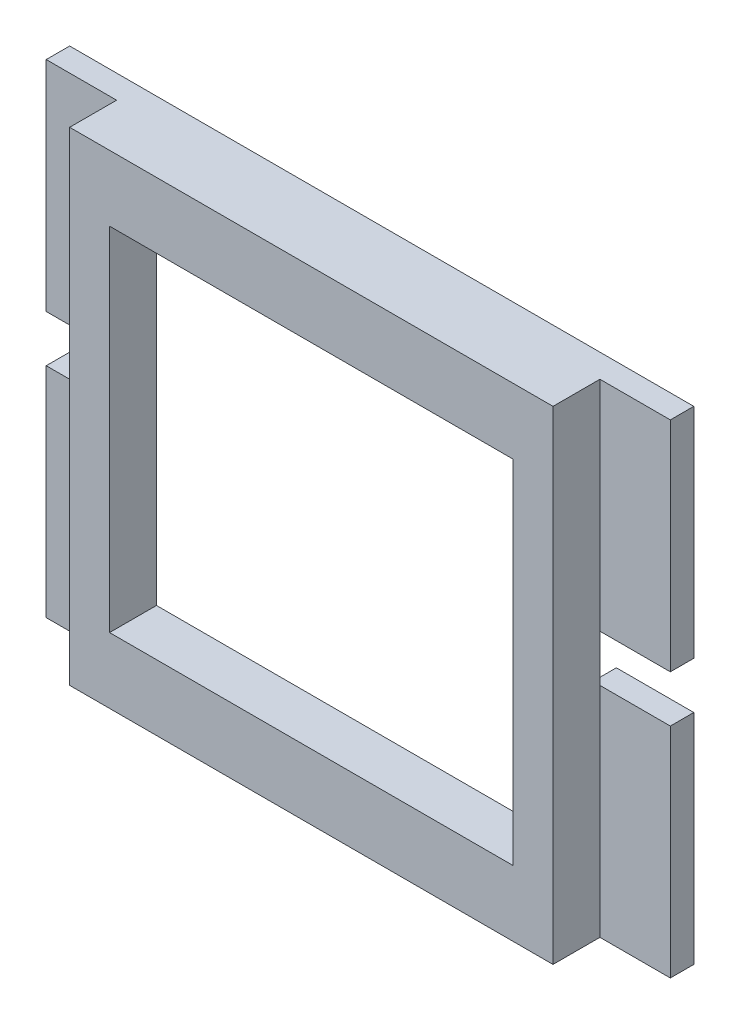
ISO-10303-21;
HEADER;
FILE_DESCRIPTION(('STEP AP214'),'2;1');
FILE_NAME('part.step','',(''),(''),'','','');
FILE_SCHEMA(('AUTOMOTIVE_DESIGN { 1 0 10303 214 1 1 1 1 }'));
ENDSEC;
DATA;
#1=APPLICATION_CONTEXT('core data for automotive mechanical design processes');
#2=APPLICATION_PROTOCOL_DEFINITION('international standard','automotive_design',2000,#1);
#3=PRODUCT_CONTEXT('',#1,'mechanical');
#4=PRODUCT('Part','Part','',(#3));
#5=PRODUCT_RELATED_PRODUCT_CATEGORY('part','',(#4));
#6=PRODUCT_DEFINITION_FORMATION('','',#4);
#7=PRODUCT_DEFINITION_CONTEXT('part definition',#1,'design');
#8=PRODUCT_DEFINITION('design','',#6,#7);
#9=PRODUCT_DEFINITION_SHAPE('','',#8);
#10=(LENGTH_UNIT() NAMED_UNIT(*) SI_UNIT(.MILLI.,.METRE.));
#11=(NAMED_UNIT(*) PLANE_ANGLE_UNIT() SI_UNIT($,.RADIAN.));
#12=(NAMED_UNIT(*) SI_UNIT($,.STERADIAN.) SOLID_ANGLE_UNIT());
#13=UNCERTAINTY_MEASURE_WITH_UNIT(LENGTH_MEASURE(1.E-05),#10,'distance_accuracy_value','');
#14=(GEOMETRIC_REPRESENTATION_CONTEXT(3) GLOBAL_UNCERTAINTY_ASSIGNED_CONTEXT((#13)) GLOBAL_UNIT_ASSIGNED_CONTEXT((#10,
#11,#12)) REPRESENTATION_CONTEXT('',''));
#15=CARTESIAN_POINT('',(0.,0.,0.));
#16=DIRECTION('',(0.,0.,1.));
#17=DIRECTION('',(1.,0.,0.));
#18=AXIS2_PLACEMENT_3D('',#15,#16,#17);
#19=CARTESIAN_POINT('',(0.,0.,0.));
#20=DIRECTION('',(0.,0.,1.));
#21=DIRECTION('',(1.,0.,0.));
#22=AXIS2_PLACEMENT_3D('',#19,#20,#21);
#23=PLANE('',#22);
#24=DIRECTION('',(-1.,0.,0.));
#25=VECTOR('',#24,1.);
#26=CARTESIAN_POINT('',(0.,-56.5,0.));
#27=LINE('',#26,#25);
#28=CARTESIAN_POINT('',(118.,-56.5,0.));
#29=VERTEX_POINT('',#28);
#30=CARTESIAN_POINT('',(101.5,-56.5,0.));
#31=VERTEX_POINT('',#30);
#32=EDGE_CURVE('E305',#29,#31,#27,.T.);
#33=ORIENTED_EDGE('',*,*,#32,.F.);
#34=DIRECTION('',(0.,-1.,0.));
#35=VECTOR('',#34,1.);
#36=CARTESIAN_POINT('',(118.,0.,0.));
#37=LINE('',#36,#35);
#38=CARTESIAN_POINT('',(118.,-103.,0.));
#39=VERTEX_POINT('',#38);
#40=EDGE_CURVE('E223',#29,#39,#37,.T.);
#41=ORIENTED_EDGE('',*,*,#40,.T.);
#42=DIRECTION('',(1.,0.,0.));
#43=VECTOR('',#42,1.);
#44=CARTESIAN_POINT('',(0.,-103.,0.));
#45=LINE('',#44,#43);
#46=CARTESIAN_POINT('',(-15.,-103.,0.));
#47=VERTEX_POINT('',#46);
#48=EDGE_CURVE('E270',#47,#39,#45,.T.);
#49=ORIENTED_EDGE('',*,*,#48,.F.);
#50=DIRECTION('',(0.,1.,0.));
#51=VECTOR('',#50,1.);
#52=CARTESIAN_POINT('',(-15.,0.,0.));
#53=LINE('',#52,#51);
#54=CARTESIAN_POINT('',(-15.,-56.5,0.));
#55=VERTEX_POINT('',#54);
#56=EDGE_CURVE('E264',#47,#55,#53,.T.);
#57=ORIENTED_EDGE('',*,*,#56,.T.);
#58=DIRECTION('',(1.,0.,0.));
#59=VECTOR('',#58,1.);
#60=CARTESIAN_POINT('',(0.,-56.5,0.));
#61=LINE('',#60,#59);
#62=CARTESIAN_POINT('',(1.5,-56.5,0.));
#63=VERTEX_POINT('',#62);
#64=EDGE_CURVE('E367',#55,#63,#61,.T.);
#65=ORIENTED_EDGE('',*,*,#64,.T.);
#66=DIRECTION('',(0.,1.,0.));
#67=VECTOR('',#66,1.);
#68=CARTESIAN_POINT('',(1.5,0.,0.));
#69=LINE('',#68,#67);
#70=CARTESIAN_POINT('',(1.5,-101.5,0.));
#71=VERTEX_POINT('',#70);
#72=EDGE_CURVE('E423',#71,#63,#69,.T.);
#73=ORIENTED_EDGE('',*,*,#72,.F.);
#74=DIRECTION('',(-1.,0.,0.));
#75=VECTOR('',#74,1.);
#76=CARTESIAN_POINT('',(0.,-101.5,0.));
#77=LINE('',#76,#75);
#78=CARTESIAN_POINT('',(101.5,-101.5,0.));
#79=VERTEX_POINT('',#78);
#80=EDGE_CURVE('E400',#79,#71,#77,.T.);
#81=ORIENTED_EDGE('',*,*,#80,.F.);
#82=DIRECTION('',(0.,1.,0.));
#83=VECTOR('',#82,1.);
#84=CARTESIAN_POINT('',(101.5,0.,0.));
#85=LINE('',#84,#83);
#86=EDGE_CURVE('E316',#79,#31,#85,.T.);
#87=ORIENTED_EDGE('',*,*,#86,.T.);
#88=EDGE_LOOP('',(#33,#41,#49,#57,#65,#73,#81,#87));
#89=FACE_BOUND('',#88,.T.);
#90=ADVANCED_FACE('F33',(#89),#23,.F.);
#91=DIRECTION('',(1.,0.,0.));
#92=VECTOR('',#91,1.);
#93=CARTESIAN_POINT('',(0.,-46.5,0.));
#94=LINE('',#93,#92);
#95=CARTESIAN_POINT('',(101.5,-46.5,0.));
#96=VERTEX_POINT('',#95);
#97=CARTESIAN_POINT('',(118.,-46.5,0.));
#98=VERTEX_POINT('',#97);
#99=EDGE_CURVE('E439',#96,#98,#94,.T.);
#100=ORIENTED_EDGE('',*,*,#99,.F.);
#101=CARTESIAN_POINT('',(101.5,-1.49999999999999,0.));
#102=VERTEX_POINT('',#101);
#103=EDGE_CURVE('E427',#96,#102,#85,.T.);
#104=ORIENTED_EDGE('',*,*,#103,.T.);
#105=DIRECTION('',(-1.,0.,0.));
#106=VECTOR('',#105,1.);
#107=CARTESIAN_POINT('',(0.,-1.5,0.));
#108=LINE('',#107,#106);
#109=CARTESIAN_POINT('',(1.5,-1.5,0.));
#110=VERTEX_POINT('',#109);
#111=EDGE_CURVE('E425',#102,#110,#108,.T.);
#112=ORIENTED_EDGE('',*,*,#111,.T.);
#113=CARTESIAN_POINT('',(1.5,-46.5,0.));
#114=VERTEX_POINT('',#113);
#115=EDGE_CURVE('E422',#114,#110,#69,.T.);
#116=ORIENTED_EDGE('',*,*,#115,.F.);
#117=DIRECTION('',(-1.,0.,0.));
#118=VECTOR('',#117,1.);
#119=CARTESIAN_POINT('',(0.,-46.5,0.));
#120=LINE('',#119,#118);
#121=CARTESIAN_POINT('',(-15.,-46.5,0.));
#122=VERTEX_POINT('',#121);
#123=EDGE_CURVE('E372',#114,#122,#120,.T.);
#124=ORIENTED_EDGE('',*,*,#123,.T.);
#125=CARTESIAN_POINT('',(-15.,0.,0.));
#126=VERTEX_POINT('',#125);
#127=EDGE_CURVE('E246',#122,#126,#53,.T.);
#128=ORIENTED_EDGE('',*,*,#127,.T.);
#129=DIRECTION('',(-1.,0.,0.));
#130=VECTOR('',#129,1.);
#131=CARTESIAN_POINT('',(0.,0.,0.));
#132=LINE('',#131,#130);
#133=CARTESIAN_POINT('',(118.,0.,0.));
#134=VERTEX_POINT('',#133);
#135=EDGE_CURVE('E277',#134,#126,#132,.T.);
#136=ORIENTED_EDGE('',*,*,#135,.F.);
#137=EDGE_CURVE('E240',#134,#98,#37,.T.);
#138=ORIENTED_EDGE('',*,*,#137,.T.);
#139=EDGE_LOOP('',(#100,#104,#112,#116,#124,#128,#136,#138));
#140=FACE_BOUND('',#139,.T.);
#141=ADVANCED_FACE('F465',(#140),#23,.F.);
#142=CARTESIAN_POINT('',(118.,0.,5.));
#143=DIRECTION('',(1.,0.,0.));
#144=DIRECTION('',(0.,1.,0.));
#145=AXIS2_PLACEMENT_3D('',#142,#143,#144);
#146=PLANE('',#145);
#147=ORIENTED_EDGE('',*,*,#40,.F.);
#148=DIRECTION('',(0.,0.,1.));
#149=VECTOR('',#148,1.);
#150=CARTESIAN_POINT('',(118.,-56.5,5.));
#151=LINE('',#150,#149);
#152=CARTESIAN_POINT('',(118.,-56.5,5.));
#153=VERTEX_POINT('',#152);
#154=EDGE_CURVE('E209',#29,#153,#151,.T.);
#155=ORIENTED_EDGE('',*,*,#154,.T.);
#156=DIRECTION('',(0.,-1.,0.));
#157=VECTOR('',#156,1.);
#158=CARTESIAN_POINT('',(118.,0.,5.));
#159=LINE('',#158,#157);
#160=CARTESIAN_POINT('',(118.,-103.,5.));
#161=VERTEX_POINT('',#160);
#162=EDGE_CURVE('E221',#153,#161,#159,.T.);
#163=ORIENTED_EDGE('',*,*,#162,.T.);
#164=DIRECTION('',(0.,0.,-1.));
#165=VECTOR('',#164,1.);
#166=CARTESIAN_POINT('',(118.,-103.,5.));
#167=LINE('',#166,#165);
#168=EDGE_CURVE('E244',#161,#39,#167,.T.);
#169=ORIENTED_EDGE('',*,*,#168,.T.);
#170=EDGE_LOOP('',(#147,#155,#163,#169));
#171=FACE_BOUND('',#170,.T.);
#172=ADVANCED_FACE('F219',(#171),#146,.T.);
#173=CARTESIAN_POINT('',(118.,0.,5.));
#174=VERTEX_POINT('',#173);
#175=CARTESIAN_POINT('',(118.,-46.5,5.));
#176=VERTEX_POINT('',#175);
#177=EDGE_CURVE('E229',#174,#176,#159,.T.);
#178=ORIENTED_EDGE('',*,*,#177,.T.);
#179=DIRECTION('',(0.,0.,-1.));
#180=VECTOR('',#179,1.);
#181=CARTESIAN_POINT('',(118.,-46.5,5.));
#182=LINE('',#181,#180);
#183=EDGE_CURVE('E445',#176,#98,#182,.T.);
#184=ORIENTED_EDGE('',*,*,#183,.T.);
#185=ORIENTED_EDGE('',*,*,#137,.F.);
#186=DIRECTION('',(0.,0.,-1.));
#187=VECTOR('',#186,1.);
#188=CARTESIAN_POINT('',(118.,0.,5.));
#189=LINE('',#188,#187);
#190=EDGE_CURVE('E239',#174,#134,#189,.T.);
#191=ORIENTED_EDGE('',*,*,#190,.F.);
#192=EDGE_LOOP('',(#178,#184,#185,#191));
#193=FACE_BOUND('',#192,.T.);
#194=ADVANCED_FACE('F536',(#193),#146,.T.);
#195=CARTESIAN_POINT('',(0.,0.,5.));
#196=DIRECTION('',(0.,0.,1.));
#197=DIRECTION('',(1.,0.,0.));
#198=AXIS2_PLACEMENT_3D('',#195,#196,#197);
#199=PLANE('',#198);
#200=ORIENTED_EDGE('',*,*,#162,.F.);
#201=DIRECTION('',(1.,0.,0.));
#202=VECTOR('',#201,1.);
#203=CARTESIAN_POINT('',(-5.64213562373093,-56.5,5.));
#204=LINE('',#203,#202);
#205=CARTESIAN_POINT('',(103.,-56.5,5.));
#206=VERTEX_POINT('',#205);
#207=EDGE_CURVE('E206',#206,#153,#204,.T.);
#208=ORIENTED_EDGE('',*,*,#207,.F.);
#209=DIRECTION('',(0.,1.,0.));
#210=VECTOR('',#209,1.);
#211=CARTESIAN_POINT('',(103.,0.,5.));
#212=LINE('',#211,#210);
#213=CARTESIAN_POINT('',(103.,-103.,5.));
#214=VERTEX_POINT('',#213);
#215=EDGE_CURVE('E234',#214,#206,#212,.T.);
#216=ORIENTED_EDGE('',*,*,#215,.F.);
#217=DIRECTION('',(-1.,0.,0.));
#218=VECTOR('',#217,1.);
#219=CARTESIAN_POINT('',(103.,-103.,5.));
#220=LINE('',#219,#218);
#221=EDGE_CURVE('E228',#161,#214,#220,.T.);
#222=ORIENTED_EDGE('',*,*,#221,.F.);
#223=EDGE_LOOP('',(#200,#208,#216,#222));
#224=FACE_BOUND('',#223,.T.);
#225=ADVANCED_FACE('F226',(#224),#199,.T.);
#226=CARTESIAN_POINT('',(103.,-46.5,5.));
#227=VERTEX_POINT('',#226);
#228=CARTESIAN_POINT('',(103.,0.,5.));
#229=VERTEX_POINT('',#228);
#230=EDGE_CURVE('E243',#227,#229,#212,.T.);
#231=ORIENTED_EDGE('',*,*,#230,.F.);
#232=DIRECTION('',(1.,0.,0.));
#233=VECTOR('',#232,1.);
#234=CARTESIAN_POINT('',(-5.64213562373095,-46.5,5.));
#235=LINE('',#234,#233);
#236=EDGE_CURVE('E446',#227,#176,#235,.T.);
#237=ORIENTED_EDGE('',*,*,#236,.T.);
#238=ORIENTED_EDGE('',*,*,#177,.F.);
#239=DIRECTION('',(1.,0.,0.));
#240=VECTOR('',#239,1.);
#241=CARTESIAN_POINT('',(103.,0.,5.));
#242=LINE('',#241,#240);
#243=EDGE_CURVE('E230',#229,#174,#242,.T.);
#244=ORIENTED_EDGE('',*,*,#243,.F.);
#245=EDGE_LOOP('',(#231,#237,#238,#244));
#246=FACE_BOUND('',#245,.T.);
#247=ADVANCED_FACE('F331',(#246),#199,.T.);
#248=CARTESIAN_POINT('',(101.5,0.,5.));
#249=DIRECTION('',(-1.,0.,0.));
#250=DIRECTION('',(0.,0.,1.));
#251=AXIS2_PLACEMENT_3D('',#248,#249,#250);
#252=PLANE('',#251);
#253=DIRECTION('',(0.,1.,0.));
#254=VECTOR('',#253,1.);
#255=CARTESIAN_POINT('',(101.5,0.,5.));
#256=LINE('',#255,#254);
#257=CARTESIAN_POINT('',(101.5,-101.5,5.));
#258=VERTEX_POINT('',#257);
#259=CARTESIAN_POINT('',(101.5,-56.5,5.));
#260=VERTEX_POINT('',#259);
#261=EDGE_CURVE('E323',#258,#260,#256,.T.);
#262=ORIENTED_EDGE('',*,*,#261,.T.);
#263=DIRECTION('',(0.,0.,-1.));
#264=VECTOR('',#263,1.);
#265=CARTESIAN_POINT('',(101.5,-56.5,5.));
#266=LINE('',#265,#264);
#267=EDGE_CURVE('E355',#260,#31,#266,.T.);
#268=ORIENTED_EDGE('',*,*,#267,.T.);
#269=ORIENTED_EDGE('',*,*,#86,.F.);
#270=DIRECTION('',(0.,0.,-1.));
#271=VECTOR('',#270,1.);
#272=CARTESIAN_POINT('',(101.5,-101.5,5.));
#273=LINE('',#272,#271);
#274=EDGE_CURVE('E306',#258,#79,#273,.T.);
#275=ORIENTED_EDGE('',*,*,#274,.F.);
#276=EDGE_LOOP('',(#262,#268,#269,#275));
#277=FACE_BOUND('',#276,.T.);
#278=ADVANCED_FACE('F437',(#277),#252,.T.);
#279=ORIENTED_EDGE('',*,*,#103,.F.);
#280=DIRECTION('',(0.,0.,1.));
#281=VECTOR('',#280,1.);
#282=CARTESIAN_POINT('',(101.5,-46.5,5.));
#283=LINE('',#282,#281);
#284=CARTESIAN_POINT('',(101.5,-46.5,5.));
#285=VERTEX_POINT('',#284);
#286=EDGE_CURVE('E440',#96,#285,#283,.T.);
#287=ORIENTED_EDGE('',*,*,#286,.T.);
#288=CARTESIAN_POINT('',(101.5,-1.49999999999999,5.));
#289=VERTEX_POINT('',#288);
#290=EDGE_CURVE('E418',#285,#289,#256,.T.);
#291=ORIENTED_EDGE('',*,*,#290,.T.);
#292=DIRECTION('',(0.,0.,-1.));
#293=VECTOR('',#292,1.);
#294=CARTESIAN_POINT('',(101.5,-1.49999999999999,5.));
#295=LINE('',#294,#293);
#296=EDGE_CURVE('E307',#289,#102,#295,.T.);
#297=ORIENTED_EDGE('',*,*,#296,.T.);
#298=EDGE_LOOP('',(#279,#287,#291,#297));
#299=FACE_BOUND('',#298,.T.);
#300=ADVANCED_FACE('F458',(#299),#252,.T.);
#301=CARTESIAN_POINT('',(-15.,0.,5.));
#302=DIRECTION('',(-1.,0.,0.));
#303=DIRECTION('',(0.,-1.,0.));
#304=AXIS2_PLACEMENT_3D('',#301,#302,#303);
#305=PLANE('',#304);
#306=DIRECTION('',(0.,0.,-1.));
#307=VECTOR('',#306,1.);
#308=CARTESIAN_POINT('',(-15.,-46.5,5.));
#309=LINE('',#308,#307);
#310=CARTESIAN_POINT('',(-15.,-46.5,5.));
#311=VERTEX_POINT('',#310);
#312=EDGE_CURVE('E352',#311,#122,#309,.T.);
#313=ORIENTED_EDGE('',*,*,#312,.F.);
#314=DIRECTION('',(0.,1.,0.));
#315=VECTOR('',#314,1.);
#316=CARTESIAN_POINT('',(-15.,0.,5.));
#317=LINE('',#316,#315);
#318=CARTESIAN_POINT('',(-15.,0.,5.));
#319=VERTEX_POINT('',#318);
#320=EDGE_CURVE('E256',#311,#319,#317,.T.);
#321=ORIENTED_EDGE('',*,*,#320,.T.);
#322=DIRECTION('',(0.,0.,-1.));
#323=VECTOR('',#322,1.);
#324=CARTESIAN_POINT('',(-15.,0.,5.));
#325=LINE('',#324,#323);
#326=EDGE_CURVE('E267',#319,#126,#325,.T.);
#327=ORIENTED_EDGE('',*,*,#326,.T.);
#328=ORIENTED_EDGE('',*,*,#127,.F.);
#329=EDGE_LOOP('',(#313,#321,#327,#328));
#330=FACE_BOUND('',#329,.T.);
#331=ADVANCED_FACE('F470',(#330),#305,.T.);
#332=CARTESIAN_POINT('',(0.,0.,5.));
#333=DIRECTION('',(0.,0.,-1.));
#334=DIRECTION('',(-1.,0.,0.));
#335=AXIS2_PLACEMENT_3D('',#332,#333,#334);
#336=PLANE('',#335);
#337=ORIENTED_EDGE('',*,*,#320,.F.);
#338=DIRECTION('',(-1.,0.,0.));
#339=VECTOR('',#338,1.);
#340=CARTESIAN_POINT('',(22.642135623731,-46.5,5.));
#341=LINE('',#340,#339);
#342=CARTESIAN_POINT('',(0.,-46.5,5.));
#343=VERTEX_POINT('',#342);
#344=EDGE_CURVE('E359',#343,#311,#341,.T.);
#345=ORIENTED_EDGE('',*,*,#344,.F.);
#346=DIRECTION('',(0.,-1.,0.));
#347=VECTOR('',#346,1.);
#348=CARTESIAN_POINT('',(0.,0.,5.));
#349=LINE('',#348,#347);
#350=CARTESIAN_POINT('',(0.,0.,5.));
#351=VERTEX_POINT('',#350);
#352=EDGE_CURVE('E249',#351,#343,#349,.T.);
#353=ORIENTED_EDGE('',*,*,#352,.F.);
#354=DIRECTION('',(1.,0.,0.));
#355=VECTOR('',#354,1.);
#356=CARTESIAN_POINT('',(0.,0.,5.));
#357=LINE('',#356,#355);
#358=EDGE_CURVE('E260',#319,#351,#357,.T.);
#359=ORIENTED_EDGE('',*,*,#358,.F.);
#360=EDGE_LOOP('',(#337,#345,#353,#359));
#361=FACE_BOUND('',#360,.T.);
#362=ADVANCED_FACE('F475',(#361),#336,.F.);
#363=CARTESIAN_POINT('',(1.5,0.,5.));
#364=DIRECTION('',(-1.,0.,0.));
#365=DIRECTION('',(0.,0.,1.));
#366=AXIS2_PLACEMENT_3D('',#363,#364,#365);
#367=PLANE('',#366);
#368=DIRECTION('',(0.,1.,0.));
#369=VECTOR('',#368,1.);
#370=CARTESIAN_POINT('',(1.5,0.,5.));
#371=LINE('',#370,#369);
#372=CARTESIAN_POINT('',(1.49999999999999,-46.5,5.));
#373=VERTEX_POINT('',#372);
#374=CARTESIAN_POINT('',(1.5,-1.5,5.));
#375=VERTEX_POINT('',#374);
#376=EDGE_CURVE('E411',#373,#375,#371,.T.);
#377=ORIENTED_EDGE('',*,*,#376,.F.);
#378=DIRECTION('',(0.,0.,-1.));
#379=VECTOR('',#378,1.);
#380=CARTESIAN_POINT('',(1.5,-46.5,5.));
#381=LINE('',#380,#379);
#382=EDGE_CURVE('E369',#373,#114,#381,.T.);
#383=ORIENTED_EDGE('',*,*,#382,.T.);
#384=ORIENTED_EDGE('',*,*,#115,.T.);
#385=DIRECTION('',(0.,0.,-1.));
#386=VECTOR('',#385,1.);
#387=CARTESIAN_POINT('',(1.5,-1.5,5.));
#388=LINE('',#387,#386);
#389=EDGE_CURVE('E313',#375,#110,#388,.T.);
#390=ORIENTED_EDGE('',*,*,#389,.F.);
#391=EDGE_LOOP('',(#377,#383,#384,#390));
#392=FACE_BOUND('',#391,.T.);
#393=ADVANCED_FACE('F464',(#392),#367,.F.);
#394=CARTESIAN_POINT('',(0.,0.,15.));
#395=DIRECTION('',(1.,0.,0.));
#396=DIRECTION('',(0.,0.,-1.));
#397=AXIS2_PLACEMENT_3D('',#394,#395,#396);
#398=PLANE('',#397);
#399=DIRECTION('',(0.,0.,-1.));
#400=VECTOR('',#399,1.);
#401=CARTESIAN_POINT('',(0.,0.,15.));
#402=LINE('',#401,#400);
#403=CARTESIAN_POINT('',(0.,0.,15.));
#404=VERTEX_POINT('',#403);
#405=EDGE_CURVE('E283',#404,#351,#402,.T.);
#406=ORIENTED_EDGE('',*,*,#405,.T.);
#407=ORIENTED_EDGE('',*,*,#352,.T.);
#408=DIRECTION('',(0.,-1.,0.));
#409=VECTOR('',#408,1.);
#410=CARTESIAN_POINT('',(0.,0.,5.));
#411=LINE('',#410,#409);
#412=CARTESIAN_POINT('',(0.,-56.5,5.));
#413=VERTEX_POINT('',#412);
#414=EDGE_CURVE('E363',#343,#413,#411,.T.);
#415=ORIENTED_EDGE('',*,*,#414,.T.);
#416=CARTESIAN_POINT('',(0.,-103.,5.));
#417=VERTEX_POINT('',#416);
#418=EDGE_CURVE('E253',#413,#417,#349,.T.);
#419=ORIENTED_EDGE('',*,*,#418,.T.);
#420=DIRECTION('',(0.,0.,-1.));
#421=VECTOR('',#420,1.);
#422=CARTESIAN_POINT('',(0.,-103.,15.));
#423=LINE('',#422,#421);
#424=CARTESIAN_POINT('',(0.,-103.,15.));
#425=VERTEX_POINT('',#424);
#426=EDGE_CURVE('E11',#425,#417,#423,.T.);
#427=ORIENTED_EDGE('',*,*,#426,.F.);
#428=DIRECTION('',(0.,-1.,0.));
#429=VECTOR('',#428,1.);
#430=CARTESIAN_POINT('',(0.,0.,15.));
#431=LINE('',#430,#429);
#432=EDGE_CURVE('E273',#404,#425,#431,.T.);
#433=ORIENTED_EDGE('',*,*,#432,.F.);
#434=EDGE_LOOP('',(#406,#407,#415,#419,#427,#433));
#435=FACE_BOUND('',#434,.T.);
#436=ADVANCED_FACE('F35',(#435),#398,.F.);
#437=CARTESIAN_POINT('',(0.,-103.,15.));
#438=DIRECTION('',(0.,1.,0.));
#439=DIRECTION('',(0.,0.,1.));
#440=AXIS2_PLACEMENT_3D('',#437,#438,#439);
#441=PLANE('',#440);
#442=ORIENTED_EDGE('',*,*,#48,.T.);
#443=ORIENTED_EDGE('',*,*,#168,.F.);
#444=ORIENTED_EDGE('',*,*,#221,.T.);
#445=DIRECTION('',(0.,0.,-1.));
#446=VECTOR('',#445,1.);
#447=CARTESIAN_POINT('',(103.,-103.,15.));
#448=LINE('',#447,#446);
#449=CARTESIAN_POINT('',(103.,-103.,15.));
#450=VERTEX_POINT('',#449);
#451=EDGE_CURVE('E41',#450,#214,#448,.T.);
#452=ORIENTED_EDGE('',*,*,#451,.F.);
#453=DIRECTION('',(1.,0.,0.));
#454=VECTOR('',#453,1.);
#455=CARTESIAN_POINT('',(0.,-103.,15.));
#456=LINE('',#455,#454);
#457=EDGE_CURVE('E276',#425,#450,#456,.T.);
#458=ORIENTED_EDGE('',*,*,#457,.F.);
#459=ORIENTED_EDGE('',*,*,#426,.T.);
#460=DIRECTION('',(-1.,0.,0.));
#461=VECTOR('',#460,1.);
#462=CARTESIAN_POINT('',(0.,-103.,5.));
#463=LINE('',#462,#461);
#464=CARTESIAN_POINT('',(-15.,-103.,5.));
#465=VERTEX_POINT('',#464);
#466=EDGE_CURVE('E252',#417,#465,#463,.T.);
#467=ORIENTED_EDGE('',*,*,#466,.T.);
#468=DIRECTION('',(0.,0.,-1.));
#469=VECTOR('',#468,1.);
#470=CARTESIAN_POINT('',(-15.,-103.,5.));
#471=LINE('',#470,#469);
#472=EDGE_CURVE('E263',#465,#47,#471,.T.);
#473=ORIENTED_EDGE('',*,*,#472,.T.);
#474=EDGE_LOOP('',(#442,#443,#444,#452,#458,#459,#467,#473));
#475=FACE_BOUND('',#474,.T.);
#476=ADVANCED_FACE('F300',(#475),#441,.F.);
#477=CARTESIAN_POINT('',(103.,0.,15.));
#478=DIRECTION('',(-1.,0.,0.));
#479=DIRECTION('',(0.,-1.,0.));
#480=AXIS2_PLACEMENT_3D('',#477,#478,#479);
#481=PLANE('',#480);
#482=ORIENTED_EDGE('',*,*,#451,.T.);
#483=ORIENTED_EDGE('',*,*,#215,.T.);
#484=DIRECTION('',(0.,-1.,0.));
#485=VECTOR('',#484,1.);
#486=CARTESIAN_POINT('',(103.,0.,5.));
#487=LINE('',#486,#485);
#488=EDGE_CURVE('E327',#227,#206,#487,.T.);
#489=ORIENTED_EDGE('',*,*,#488,.F.);
#490=ORIENTED_EDGE('',*,*,#230,.T.);
#491=DIRECTION('',(0.,0.,-1.));
#492=VECTOR('',#491,1.);
#493=CARTESIAN_POINT('',(103.,0.,15.));
#494=LINE('',#493,#492);
#495=CARTESIAN_POINT('',(103.,0.,15.));
#496=VERTEX_POINT('',#495);
#497=EDGE_CURVE('E290',#496,#229,#494,.T.);
#498=ORIENTED_EDGE('',*,*,#497,.F.);
#499=DIRECTION('',(0.,1.,0.));
#500=VECTOR('',#499,1.);
#501=CARTESIAN_POINT('',(103.,0.,15.));
#502=LINE('',#501,#500);
#503=EDGE_CURVE('E279',#450,#496,#502,.T.);
#504=ORIENTED_EDGE('',*,*,#503,.F.);
#505=EDGE_LOOP('',(#482,#483,#489,#490,#498,#504));
#506=FACE_BOUND('',#505,.T.);
#507=ADVANCED_FACE('F296',(#506),#481,.F.);
#508=CARTESIAN_POINT('',(0.,0.,15.));
#509=DIRECTION('',(0.,-1.,0.));
#510=DIRECTION('',(0.,0.,-1.));
#511=AXIS2_PLACEMENT_3D('',#508,#509,#510);
#512=PLANE('',#511);
#513=ORIENTED_EDGE('',*,*,#135,.T.);
#514=ORIENTED_EDGE('',*,*,#326,.F.);
#515=ORIENTED_EDGE('',*,*,#358,.T.);
#516=ORIENTED_EDGE('',*,*,#405,.F.);
#517=DIRECTION('',(-1.,0.,0.));
#518=VECTOR('',#517,1.);
#519=CARTESIAN_POINT('',(0.,0.,15.));
#520=LINE('',#519,#518);
#521=EDGE_CURVE('E281',#496,#404,#520,.T.);
#522=ORIENTED_EDGE('',*,*,#521,.F.);
#523=ORIENTED_EDGE('',*,*,#497,.T.);
#524=ORIENTED_EDGE('',*,*,#243,.T.);
#525=ORIENTED_EDGE('',*,*,#190,.T.);
#526=EDGE_LOOP('',(#513,#514,#515,#516,#522,#523,#524,#525));
#527=FACE_BOUND('',#526,.T.);
#528=ADVANCED_FACE('F333',(#527),#512,.F.);
#529=CARTESIAN_POINT('',(0.,0.,15.));
#530=DIRECTION('',(0.,0.,1.));
#531=DIRECTION('',(1.,0.,0.));
#532=AXIS2_PLACEMENT_3D('',#529,#530,#531);
#533=PLANE('',#532);
#534=DIRECTION('',(0.,1.,0.));
#535=VECTOR('',#534,1.);
#536=CARTESIAN_POINT('',(8.50000000000001,-89.,15.));
#537=LINE('',#536,#535);
#538=CARTESIAN_POINT('',(8.50000000000001,-89.,15.));
#539=VERTEX_POINT('',#538);
#540=CARTESIAN_POINT('',(8.50000000000001,-14.,15.));
#541=VERTEX_POINT('',#540);
#542=EDGE_CURVE('E376',#539,#541,#537,.T.);
#543=ORIENTED_EDGE('',*,*,#542,.T.);
#544=DIRECTION('',(1.,0.,0.));
#545=VECTOR('',#544,1.);
#546=CARTESIAN_POINT('',(94.5,-14.,15.));
#547=LINE('',#546,#545);
#548=CARTESIAN_POINT('',(94.5,-14.,15.));
#549=VERTEX_POINT('',#548);
#550=EDGE_CURVE('E379',#541,#549,#547,.T.);
#551=ORIENTED_EDGE('',*,*,#550,.T.);
#552=DIRECTION('',(0.,-1.,0.));
#553=VECTOR('',#552,1.);
#554=CARTESIAN_POINT('',(94.5,-89.,15.));
#555=LINE('',#554,#553);
#556=CARTESIAN_POINT('',(94.5,-89.,15.));
#557=VERTEX_POINT('',#556);
#558=EDGE_CURVE('E383',#549,#557,#555,.T.);
#559=ORIENTED_EDGE('',*,*,#558,.T.);
#560=DIRECTION('',(-1.,0.,0.));
#561=VECTOR('',#560,1.);
#562=CARTESIAN_POINT('',(94.5,-89.,15.));
#563=LINE('',#562,#561);
#564=EDGE_CURVE('E386',#557,#539,#563,.T.);
#565=ORIENTED_EDGE('',*,*,#564,.T.);
#566=EDGE_LOOP('',(#543,#551,#559,#565));
#567=FACE_BOUND('',#566,.T.);
#568=ORIENTED_EDGE('',*,*,#432,.T.);
#569=ORIENTED_EDGE('',*,*,#457,.T.);
#570=ORIENTED_EDGE('',*,*,#503,.T.);
#571=ORIENTED_EDGE('',*,*,#521,.T.);
#572=EDGE_LOOP('',(#568,#569,#570,#571));
#573=FACE_BOUND('',#572,.T.);
#574=ADVANCED_FACE('F337',(#567,#573),#533,.T.);
#575=DIRECTION('',(0.,0.,1.));
#576=VECTOR('',#575,1.);
#577=CARTESIAN_POINT('',(-15.,-56.5,5.));
#578=LINE('',#577,#576);
#579=CARTESIAN_POINT('',(-15.,-56.5,5.));
#580=VERTEX_POINT('',#579);
#581=EDGE_CURVE('E351',#55,#580,#578,.T.);
#582=ORIENTED_EDGE('',*,*,#581,.F.);
#583=ORIENTED_EDGE('',*,*,#56,.F.);
#584=ORIENTED_EDGE('',*,*,#472,.F.);
#585=EDGE_CURVE('E257',#465,#580,#317,.T.);
#586=ORIENTED_EDGE('',*,*,#585,.T.);
#587=EDGE_LOOP('',(#582,#583,#584,#586));
#588=FACE_BOUND('',#587,.T.);
#589=ADVANCED_FACE('F350',(#588),#305,.T.);
#590=ORIENTED_EDGE('',*,*,#418,.F.);
#591=DIRECTION('',(-1.,0.,0.));
#592=VECTOR('',#591,1.);
#593=CARTESIAN_POINT('',(22.642135623731,-56.5,5.));
#594=LINE('',#593,#592);
#595=EDGE_CURVE('E347',#413,#580,#594,.T.);
#596=ORIENTED_EDGE('',*,*,#595,.T.);
#597=ORIENTED_EDGE('',*,*,#585,.F.);
#598=ORIENTED_EDGE('',*,*,#466,.F.);
#599=EDGE_LOOP('',(#590,#596,#597,#598));
#600=FACE_BOUND('',#599,.T.);
#601=ADVANCED_FACE('F345',(#600),#336,.F.);
#602=CARTESIAN_POINT('',(0.,-101.5,5.));
#603=DIRECTION('',(0.,-1.,0.));
#604=DIRECTION('',(0.,0.,-1.));
#605=AXIS2_PLACEMENT_3D('',#602,#603,#604);
#606=PLANE('',#605);
#607=ORIENTED_EDGE('',*,*,#80,.T.);
#608=DIRECTION('',(0.,0.,-1.));
#609=VECTOR('',#608,1.);
#610=CARTESIAN_POINT('',(1.49999999999999,-101.5,5.));
#611=LINE('',#610,#609);
#612=CARTESIAN_POINT('',(1.49999999999999,-101.5,5.));
#613=VERTEX_POINT('',#612);
#614=EDGE_CURVE('E321',#613,#71,#611,.T.);
#615=ORIENTED_EDGE('',*,*,#614,.F.);
#616=DIRECTION('',(-1.,0.,0.));
#617=VECTOR('',#616,1.);
#618=CARTESIAN_POINT('',(0.,-101.5,5.));
#619=LINE('',#618,#617);
#620=EDGE_CURVE('E408',#258,#613,#619,.T.);
#621=ORIENTED_EDGE('',*,*,#620,.F.);
#622=ORIENTED_EDGE('',*,*,#274,.T.);
#623=EDGE_LOOP('',(#607,#615,#621,#622));
#624=FACE_BOUND('',#623,.T.);
#625=ADVANCED_FACE('F527',(#624),#606,.F.);
#626=CARTESIAN_POINT('',(0.,-1.5,5.));
#627=DIRECTION('',(0.,-1.,0.));
#628=DIRECTION('',(0.,0.,-1.));
#629=AXIS2_PLACEMENT_3D('',#626,#627,#628);
#630=PLANE('',#629);
#631=ORIENTED_EDGE('',*,*,#111,.F.);
#632=ORIENTED_EDGE('',*,*,#296,.F.);
#633=DIRECTION('',(-1.,0.,0.));
#634=VECTOR('',#633,1.);
#635=CARTESIAN_POINT('',(0.,-1.5,5.));
#636=LINE('',#635,#634);
#637=EDGE_CURVE('E415',#289,#375,#636,.T.);
#638=ORIENTED_EDGE('',*,*,#637,.T.);
#639=ORIENTED_EDGE('',*,*,#389,.T.);
#640=EDGE_LOOP('',(#631,#632,#638,#639));
#641=FACE_BOUND('',#640,.T.);
#642=ADVANCED_FACE('F460',(#641),#630,.T.);
#643=ORIENTED_EDGE('',*,*,#72,.T.);
#644=DIRECTION('',(0.,0.,1.));
#645=VECTOR('',#644,1.);
#646=CARTESIAN_POINT('',(1.5,-56.5,5.));
#647=LINE('',#646,#645);
#648=CARTESIAN_POINT('',(1.5,-56.5,5.));
#649=VERTEX_POINT('',#648);
#650=EDGE_CURVE('E365',#63,#649,#647,.T.);
#651=ORIENTED_EDGE('',*,*,#650,.T.);
#652=EDGE_CURVE('E412',#613,#649,#371,.T.);
#653=ORIENTED_EDGE('',*,*,#652,.F.);
#654=ORIENTED_EDGE('',*,*,#614,.T.);
#655=EDGE_LOOP('',(#643,#651,#653,#654));
#656=FACE_BOUND('',#655,.T.);
#657=ADVANCED_FACE('F512',(#656),#367,.F.);
#658=CARTESIAN_POINT('',(0.,0.,5.));
#659=DIRECTION('',(0.,0.,-1.));
#660=DIRECTION('',(-1.,0.,0.));
#661=AXIS2_PLACEMENT_3D('',#658,#659,#660);
#662=PLANE('',#661);
#663=ORIENTED_EDGE('',*,*,#290,.F.);
#664=EDGE_CURVE('E48',#285,#227,#235,.T.);
#665=ORIENTED_EDGE('',*,*,#664,.T.);
#666=ORIENTED_EDGE('',*,*,#488,.T.);
#667=EDGE_CURVE('E212',#260,#206,#204,.T.);
#668=ORIENTED_EDGE('',*,*,#667,.F.);
#669=ORIENTED_EDGE('',*,*,#261,.F.);
#670=ORIENTED_EDGE('',*,*,#620,.T.);
#671=ORIENTED_EDGE('',*,*,#652,.T.);
#672=EDGE_CURVE('E56',#649,#413,#594,.T.);
#673=ORIENTED_EDGE('',*,*,#672,.T.);
#674=ORIENTED_EDGE('',*,*,#414,.F.);
#675=EDGE_CURVE('E361',#373,#343,#341,.T.);
#676=ORIENTED_EDGE('',*,*,#675,.F.);
#677=ORIENTED_EDGE('',*,*,#376,.T.);
#678=ORIENTED_EDGE('',*,*,#637,.F.);
#679=EDGE_LOOP('',(#663,#665,#666,#668,#669,#670,#671,#673,#674,#676,#677,#678));
#680=FACE_BOUND('',#679,.T.);
#681=DIRECTION('',(-1.,0.,0.));
#682=VECTOR('',#681,1.);
#683=CARTESIAN_POINT('',(94.5,-89.,5.));
#684=LINE('',#683,#682);
#685=CARTESIAN_POINT('',(94.5,-89.,5.));
#686=VERTEX_POINT('',#685);
#687=CARTESIAN_POINT('',(8.50000000000001,-89.,5.));
#688=VERTEX_POINT('',#687);
#689=EDGE_CURVE('E380',#686,#688,#684,.T.);
#690=ORIENTED_EDGE('',*,*,#689,.F.);
#691=DIRECTION('',(0.,-1.,0.));
#692=VECTOR('',#691,1.);
#693=CARTESIAN_POINT('',(94.5,-89.,5.));
#694=LINE('',#693,#692);
#695=CARTESIAN_POINT('',(94.5,-14.,5.));
#696=VERTEX_POINT('',#695);
#697=EDGE_CURVE('E394',#696,#686,#694,.T.);
#698=ORIENTED_EDGE('',*,*,#697,.F.);
#699=DIRECTION('',(1.,0.,0.));
#700=VECTOR('',#699,1.);
#701=CARTESIAN_POINT('',(94.5,-14.,5.));
#702=LINE('',#701,#700);
#703=CARTESIAN_POINT('',(8.50000000000001,-14.,5.));
#704=VERTEX_POINT('',#703);
#705=EDGE_CURVE('E391',#704,#696,#702,.T.);
#706=ORIENTED_EDGE('',*,*,#705,.F.);
#707=DIRECTION('',(0.,1.,0.));
#708=VECTOR('',#707,1.);
#709=CARTESIAN_POINT('',(8.50000000000001,-89.,5.));
#710=LINE('',#709,#708);
#711=EDGE_CURVE('E375',#688,#704,#710,.T.);
#712=ORIENTED_EDGE('',*,*,#711,.F.);
#713=EDGE_LOOP('',(#690,#698,#706,#712));
#714=FACE_BOUND('',#713,.T.);
#715=ADVANCED_FACE('F453',(#680,#714),#662,.T.);
#716=CARTESIAN_POINT('',(8.50000000000001,-89.,15.));
#717=DIRECTION('',(-1.,0.,0.));
#718=DIRECTION('',(0.,0.,1.));
#719=AXIS2_PLACEMENT_3D('',#716,#717,#718);
#720=PLANE('',#719);
#721=ORIENTED_EDGE('',*,*,#711,.T.);
#722=DIRECTION('',(0.,0.,-1.));
#723=VECTOR('',#722,1.);
#724=CARTESIAN_POINT('',(8.50000000000001,-14.,15.));
#725=LINE('',#724,#723);
#726=EDGE_CURVE('E389',#541,#704,#725,.T.);
#727=ORIENTED_EDGE('',*,*,#726,.F.);
#728=ORIENTED_EDGE('',*,*,#542,.F.);
#729=DIRECTION('',(0.,0.,-1.));
#730=VECTOR('',#729,1.);
#731=CARTESIAN_POINT('',(8.50000000000001,-89.,15.));
#732=LINE('',#731,#730);
#733=EDGE_CURVE('E398',#539,#688,#732,.T.);
#734=ORIENTED_EDGE('',*,*,#733,.T.);
#735=EDGE_LOOP('',(#721,#727,#728,#734));
#736=FACE_BOUND('',#735,.T.);
#737=ADVANCED_FACE('F525',(#736),#720,.F.);
#738=CARTESIAN_POINT('',(94.5,-89.,15.));
#739=DIRECTION('',(0.,-1.,0.));
#740=DIRECTION('',(0.,0.,-1.));
#741=AXIS2_PLACEMENT_3D('',#738,#739,#740);
#742=PLANE('',#741);
#743=ORIENTED_EDGE('',*,*,#689,.T.);
#744=ORIENTED_EDGE('',*,*,#733,.F.);
#745=ORIENTED_EDGE('',*,*,#564,.F.);
#746=DIRECTION('',(0.,0.,-1.));
#747=VECTOR('',#746,1.);
#748=CARTESIAN_POINT('',(94.5,-89.,15.));
#749=LINE('',#748,#747);
#750=EDGE_CURVE('E401',#557,#686,#749,.T.);
#751=ORIENTED_EDGE('',*,*,#750,.T.);
#752=EDGE_LOOP('',(#743,#744,#745,#751));
#753=FACE_BOUND('',#752,.T.);
#754=ADVANCED_FACE('F553',(#753),#742,.F.);
#755=CARTESIAN_POINT('',(94.5,-89.,15.));
#756=DIRECTION('',(1.,0.,0.));
#757=DIRECTION('',(0.,0.,-1.));
#758=AXIS2_PLACEMENT_3D('',#755,#756,#757);
#759=PLANE('',#758);
#760=ORIENTED_EDGE('',*,*,#697,.T.);
#761=ORIENTED_EDGE('',*,*,#750,.F.);
#762=ORIENTED_EDGE('',*,*,#558,.F.);
#763=DIRECTION('',(0.,0.,-1.));
#764=VECTOR('',#763,1.);
#765=CARTESIAN_POINT('',(94.5,-14.,15.));
#766=LINE('',#765,#764);
#767=EDGE_CURVE('E404',#549,#696,#766,.T.);
#768=ORIENTED_EDGE('',*,*,#767,.T.);
#769=EDGE_LOOP('',(#760,#761,#762,#768));
#770=FACE_BOUND('',#769,.T.);
#771=ADVANCED_FACE('F489',(#770),#759,.F.);
#772=CARTESIAN_POINT('',(94.5,-14.,15.));
#773=DIRECTION('',(0.,1.,0.));
#774=DIRECTION('',(0.,0.,1.));
#775=AXIS2_PLACEMENT_3D('',#772,#773,#774);
#776=PLANE('',#775);
#777=ORIENTED_EDGE('',*,*,#705,.T.);
#778=ORIENTED_EDGE('',*,*,#767,.F.);
#779=ORIENTED_EDGE('',*,*,#550,.F.);
#780=ORIENTED_EDGE('',*,*,#726,.T.);
#781=EDGE_LOOP('',(#777,#778,#779,#780));
#782=FACE_BOUND('',#781,.T.);
#783=ADVANCED_FACE('F482',(#782),#776,.F.);
#784=CARTESIAN_POINT('',(22.642135623731,-46.5,5.));
#785=DIRECTION('',(0.,1.,0.));
#786=DIRECTION('',(-1.,0.,0.));
#787=AXIS2_PLACEMENT_3D('',#784,#785,#786);
#788=PLANE('',#787);
#789=ORIENTED_EDGE('',*,*,#382,.F.);
#790=ORIENTED_EDGE('',*,*,#675,.T.);
#791=ORIENTED_EDGE('',*,*,#344,.T.);
#792=ORIENTED_EDGE('',*,*,#312,.T.);
#793=ORIENTED_EDGE('',*,*,#123,.F.);
#794=EDGE_LOOP('',(#789,#790,#791,#792,#793));
#795=FACE_BOUND('',#794,.T.);
#796=ADVANCED_FACE('F479',(#795),#788,.F.);
#797=CARTESIAN_POINT('',(22.642135623731,-56.5,5.));
#798=DIRECTION('',(0.,-1.,0.));
#799=DIRECTION('',(1.,0.,0.));
#800=AXIS2_PLACEMENT_3D('',#797,#798,#799);
#801=PLANE('',#800);
#802=ORIENTED_EDGE('',*,*,#581,.T.);
#803=ORIENTED_EDGE('',*,*,#595,.F.);
#804=ORIENTED_EDGE('',*,*,#672,.F.);
#805=ORIENTED_EDGE('',*,*,#650,.F.);
#806=ORIENTED_EDGE('',*,*,#64,.F.);
#807=EDGE_LOOP('',(#802,#803,#804,#805,#806));
#808=FACE_BOUND('',#807,.T.);
#809=ADVANCED_FACE('F481',(#808),#801,.F.);
#810=CARTESIAN_POINT('',(-5.64213562373093,-56.5,5.));
#811=DIRECTION('',(0.,1.,0.));
#812=DIRECTION('',(-1.,0.,0.));
#813=AXIS2_PLACEMENT_3D('',#810,#811,#812);
#814=PLANE('',#813);
#815=ORIENTED_EDGE('',*,*,#32,.T.);
#816=ORIENTED_EDGE('',*,*,#267,.F.);
#817=ORIENTED_EDGE('',*,*,#667,.T.);
#818=ORIENTED_EDGE('',*,*,#207,.T.);
#819=ORIENTED_EDGE('',*,*,#154,.F.);
#820=EDGE_LOOP('',(#815,#816,#817,#818,#819));
#821=FACE_BOUND('',#820,.T.);
#822=ADVANCED_FACE('F208',(#821),#814,.T.);
#823=CARTESIAN_POINT('',(-5.64213562373095,-46.5,5.));
#824=DIRECTION('',(0.,-1.,0.));
#825=DIRECTION('',(1.,0.,0.));
#826=AXIS2_PLACEMENT_3D('',#823,#824,#825);
#827=PLANE('',#826);
#828=ORIENTED_EDGE('',*,*,#99,.T.);
#829=ORIENTED_EDGE('',*,*,#183,.F.);
#830=ORIENTED_EDGE('',*,*,#236,.F.);
#831=ORIENTED_EDGE('',*,*,#664,.F.);
#832=ORIENTED_EDGE('',*,*,#286,.F.);
#833=EDGE_LOOP('',(#828,#829,#830,#831,#832));
#834=FACE_BOUND('',#833,.T.);
#835=ADVANCED_FACE('F724',(#834),#827,.T.);
#836=CLOSED_SHELL('',(#90,#141,#172,#194,#225,#247,#278,#300,#331,#362,#393,#436,#476,#507,#528,
#574,#589,#601,#625,#642,#657,#715,#737,#754,#771,#783,#796,#809,#822,#835));
#837=MANIFOLD_SOLID_BREP('B2',#836);
#838=ADVANCED_BREP_SHAPE_REPRESENTATION('',(#18,#837),#14);
#839=SHAPE_DEFINITION_REPRESENTATION(#9,#838);
ENDSEC;
END-ISO-10303-21;
